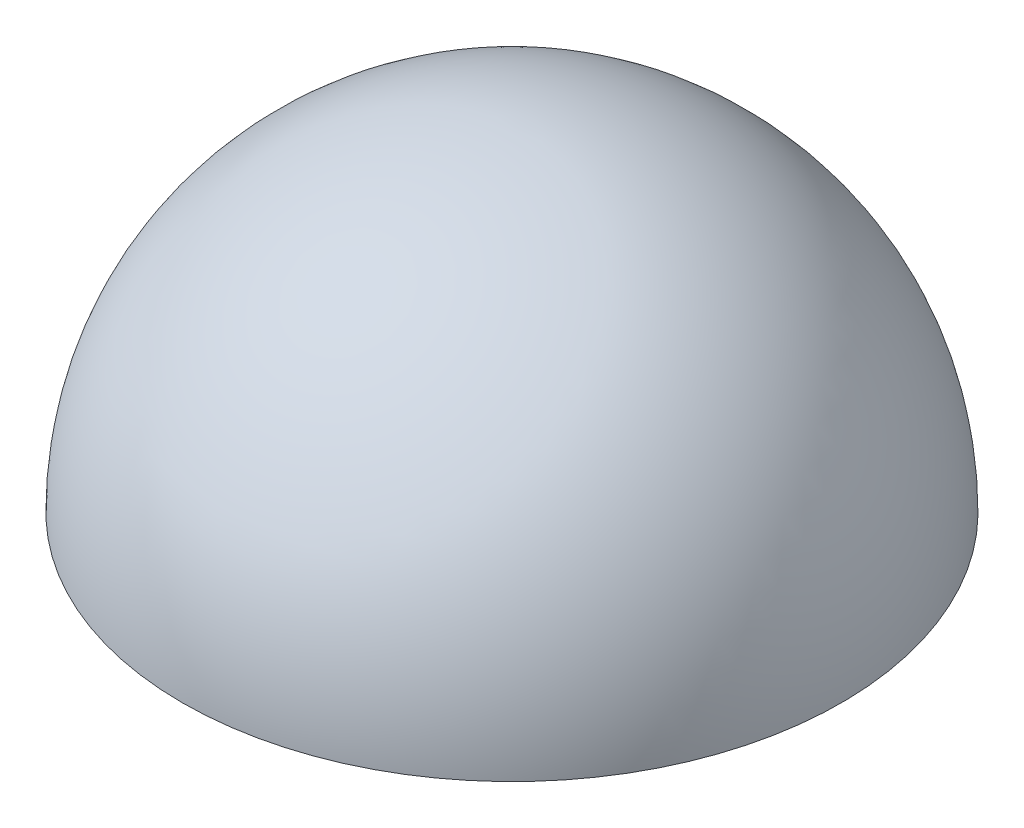
ISO-10303-21;
HEADER;
FILE_DESCRIPTION(('STEP AP214'),'2;1');
FILE_NAME('part.step','',(''),(''),'','','');
FILE_SCHEMA(('AUTOMOTIVE_DESIGN { 1 0 10303 214 1 1 1 1 }'));
ENDSEC;
DATA;
#1=APPLICATION_CONTEXT('core data for automotive mechanical design processes');
#2=APPLICATION_PROTOCOL_DEFINITION('international standard','automotive_design',2000,#1);
#3=PRODUCT_CONTEXT('',#1,'mechanical');
#4=PRODUCT('Part','Part','',(#3));
#5=PRODUCT_RELATED_PRODUCT_CATEGORY('part','',(#4));
#6=PRODUCT_DEFINITION_FORMATION('','',#4);
#7=PRODUCT_DEFINITION_CONTEXT('part definition',#1,'design');
#8=PRODUCT_DEFINITION('design','',#6,#7);
#9=PRODUCT_DEFINITION_SHAPE('','',#8);
#10=(LENGTH_UNIT() NAMED_UNIT(*) SI_UNIT(.MILLI.,.METRE.));
#11=(NAMED_UNIT(*) PLANE_ANGLE_UNIT() SI_UNIT($,.RADIAN.));
#12=(NAMED_UNIT(*) SI_UNIT($,.STERADIAN.) SOLID_ANGLE_UNIT());
#13=UNCERTAINTY_MEASURE_WITH_UNIT(LENGTH_MEASURE(1.E-05),#10,'distance_accuracy_value','');
#14=(GEOMETRIC_REPRESENTATION_CONTEXT(3) GLOBAL_UNCERTAINTY_ASSIGNED_CONTEXT((#13)) GLOBAL_UNIT_ASSIGNED_CONTEXT((#10,
#11,#12)) REPRESENTATION_CONTEXT('',''));
#15=CARTESIAN_POINT('',(0.,0.,0.));
#16=DIRECTION('',(0.,0.,1.));
#17=DIRECTION('',(1.,0.,0.));
#18=AXIS2_PLACEMENT_3D('',#15,#16,#17);
#19=CARTESIAN_POINT('',(0.,0.,0.));
#20=DIRECTION('',(0.,0.,-1.));
#21=DIRECTION('',(-1.,0.,0.));
#22=AXIS2_PLACEMENT_3D('',#19,#20,#21);
#23=SPHERICAL_SURFACE('',#22,19.05);
#24=CARTESIAN_POINT('',(0.,0.,0.));
#25=DIRECTION('',(0.,-1.,0.));
#26=DIRECTION('',(0.,0.,1.));
#27=AXIS2_PLACEMENT_3D('',#24,#25,#26);
#28=SPHERICAL_SURFACE('',#27,19.05);
#29=CARTESIAN_POINT('',(0.,0.,0.));
#30=DIRECTION('',(0.,-1.,0.));
#31=DIRECTION('',(0.,0.,1.));
#32=AXIS2_PLACEMENT_3D('',#29,#30,#31);
#33=CIRCLE('',#32,19.05);
#34=CARTESIAN_POINT('',(0.,0.,19.05));
#35=VERTEX_POINT('',#34);
#36=EDGE_CURVE('E10',#35,#35,#33,.T.);
#37=ORIENTED_EDGE('',*,*,#36,.F.);
#38=EDGE_LOOP('',(#37));
#39=FACE_BOUND('',#38,.T.);
#40=ADVANCED_FACE('F31',(#39),#28,.T.);
#41=CARTESIAN_POINT('',(0.,0.,0.));
#42=DIRECTION('',(0.,-1.,0.));
#43=DIRECTION('',(0.,0.,1.));
#44=AXIS2_PLACEMENT_3D('',#41,#42,#43);
#45=PLANE('',#44);
#46=ORIENTED_EDGE('',*,*,#36,.T.);
#47=EDGE_LOOP('',(#46));
#48=FACE_BOUND('',#47,.T.);
#49=ADVANCED_FACE('F38',(#48),#45,.T.);
#50=CLOSED_SHELL('',(#40,#49));
#51=MANIFOLD_SOLID_BREP('B2',#50);
#52=ADVANCED_BREP_SHAPE_REPRESENTATION('',(#18,#51),#14);
#53=SHAPE_DEFINITION_REPRESENTATION(#9,#52);
ENDSEC;
END-ISO-10303-21;
